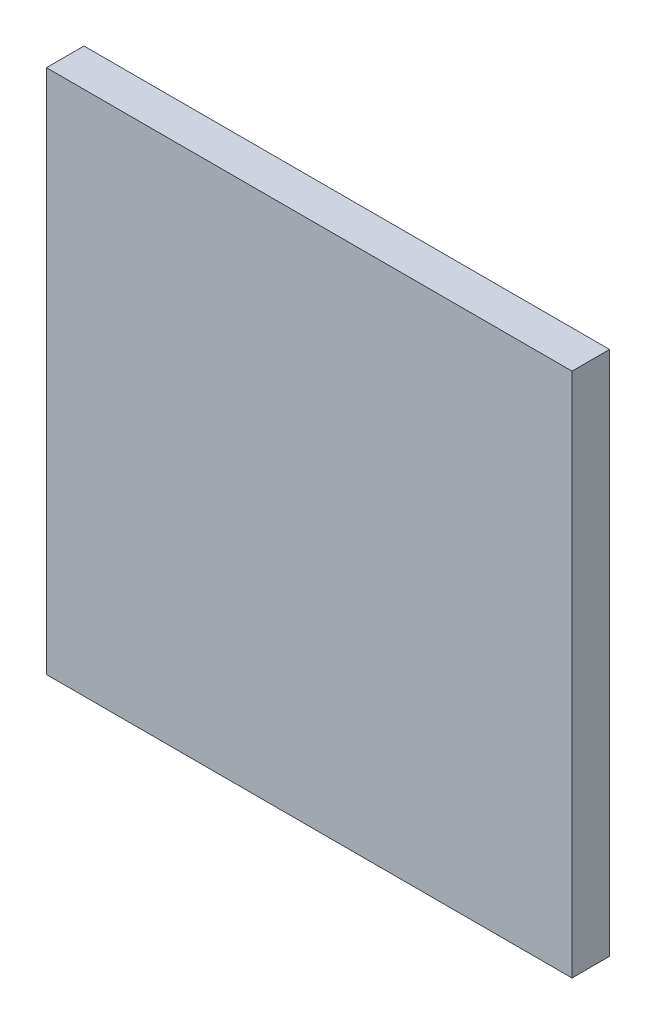
ISO-10303-21;
HEADER;
FILE_DESCRIPTION(('STEP AP214'),'2;1');
FILE_NAME('part.step','',(''),(''),'','','');
FILE_SCHEMA(('AUTOMOTIVE_DESIGN { 1 0 10303 214 1 1 1 1 }'));
ENDSEC;
DATA;
#1=APPLICATION_CONTEXT('core data for automotive mechanical design processes');
#2=APPLICATION_PROTOCOL_DEFINITION('international standard','automotive_design',2000,#1);
#3=PRODUCT_CONTEXT('',#1,'mechanical');
#4=PRODUCT('Part','Part','',(#3));
#5=PRODUCT_RELATED_PRODUCT_CATEGORY('part','',(#4));
#6=PRODUCT_DEFINITION_FORMATION('','',#4);
#7=PRODUCT_DEFINITION_CONTEXT('part definition',#1,'design');
#8=PRODUCT_DEFINITION('design','',#6,#7);
#9=PRODUCT_DEFINITION_SHAPE('','',#8);
#10=(LENGTH_UNIT() NAMED_UNIT(*) SI_UNIT(.MILLI.,.METRE.));
#11=(NAMED_UNIT(*) PLANE_ANGLE_UNIT() SI_UNIT($,.RADIAN.));
#12=(NAMED_UNIT(*) SI_UNIT($,.STERADIAN.) SOLID_ANGLE_UNIT());
#13=UNCERTAINTY_MEASURE_WITH_UNIT(LENGTH_MEASURE(1.E-05),#10,'distance_accuracy_value','');
#14=(GEOMETRIC_REPRESENTATION_CONTEXT(3) GLOBAL_UNCERTAINTY_ASSIGNED_CONTEXT((#13)) GLOBAL_UNIT_ASSIGNED_CONTEXT((#10,
#11,#12)) REPRESENTATION_CONTEXT('',''));
#15=CARTESIAN_POINT('',(0.,0.,0.));
#16=DIRECTION('',(0.,0.,1.));
#17=DIRECTION('',(1.,0.,0.));
#18=AXIS2_PLACEMENT_3D('',#15,#16,#17);
#19=CARTESIAN_POINT('',(1.75,-1.75,-0.25));
#20=DIRECTION('',(1.,0.,0.));
#21=DIRECTION('',(0.,0.,-1.));
#22=AXIS2_PLACEMENT_3D('',#19,#20,#21);
#23=PLANE('',#22);
#24=DIRECTION('',(0.,1.,0.));
#25=VECTOR('',#24,1.);
#26=CARTESIAN_POINT('',(1.75,-1.75,0.));
#27=LINE('',#26,#25);
#28=CARTESIAN_POINT('',(1.75,-1.75,0.));
#29=VERTEX_POINT('',#28);
#30=CARTESIAN_POINT('',(1.75,1.75,0.));
#31=VERTEX_POINT('',#30);
#32=EDGE_CURVE('E109',#29,#31,#27,.T.);
#33=ORIENTED_EDGE('',*,*,#32,.F.);
#34=DIRECTION('',(0.,0.,1.));
#35=VECTOR('',#34,1.);
#36=CARTESIAN_POINT('',(1.75,-1.75,-0.25));
#37=LINE('',#36,#35);
#38=CARTESIAN_POINT('',(1.75,-1.75,-0.25));
#39=VERTEX_POINT('',#38);
#40=EDGE_CURVE('E11',#39,#29,#37,.T.);
#41=ORIENTED_EDGE('',*,*,#40,.F.);
#42=DIRECTION('',(0.,1.,0.));
#43=VECTOR('',#42,1.);
#44=CARTESIAN_POINT('',(1.75,-1.75,-0.25));
#45=LINE('',#44,#43);
#46=CARTESIAN_POINT('',(1.75,1.75,-0.25));
#47=VERTEX_POINT('',#46);
#48=EDGE_CURVE('E101',#39,#47,#45,.T.);
#49=ORIENTED_EDGE('',*,*,#48,.T.);
#50=DIRECTION('',(0.,0.,1.));
#51=VECTOR('',#50,1.);
#52=CARTESIAN_POINT('',(1.75,1.75,-0.25));
#53=LINE('',#52,#51);
#54=EDGE_CURVE('E42',#47,#31,#53,.T.);
#55=ORIENTED_EDGE('',*,*,#54,.T.);
#56=EDGE_LOOP('',(#33,#41,#49,#55));
#57=FACE_BOUND('',#56,.T.);
#58=ADVANCED_FACE('F39',(#57),#23,.T.);
#59=CARTESIAN_POINT('',(-1.75,-1.75,-0.25));
#60=DIRECTION('',(0.,-1.,0.));
#61=DIRECTION('',(0.,0.,-1.));
#62=AXIS2_PLACEMENT_3D('',#59,#60,#61);
#63=PLANE('',#62);
#64=DIRECTION('',(1.,0.,0.));
#65=VECTOR('',#64,1.);
#66=CARTESIAN_POINT('',(-1.75,-1.75,0.));
#67=LINE('',#66,#65);
#68=CARTESIAN_POINT('',(-1.75,-1.75,0.));
#69=VERTEX_POINT('',#68);
#70=EDGE_CURVE('E104',#69,#29,#67,.T.);
#71=ORIENTED_EDGE('',*,*,#70,.F.);
#72=DIRECTION('',(0.,0.,1.));
#73=VECTOR('',#72,1.);
#74=CARTESIAN_POINT('',(-1.75,-1.75,-0.25));
#75=LINE('',#74,#73);
#76=CARTESIAN_POINT('',(-1.75,-1.75,-0.25));
#77=VERTEX_POINT('',#76);
#78=EDGE_CURVE('E49',#77,#69,#75,.T.);
#79=ORIENTED_EDGE('',*,*,#78,.F.);
#80=DIRECTION('',(1.,0.,0.));
#81=VECTOR('',#80,1.);
#82=CARTESIAN_POINT('',(-1.75,-1.75,-0.25));
#83=LINE('',#82,#81);
#84=EDGE_CURVE('E96',#77,#39,#83,.T.);
#85=ORIENTED_EDGE('',*,*,#84,.T.);
#86=ORIENTED_EDGE('',*,*,#40,.T.);
#87=EDGE_LOOP('',(#71,#79,#85,#86));
#88=FACE_BOUND('',#87,.T.);
#89=ADVANCED_FACE('F125',(#88),#63,.T.);
#90=CARTESIAN_POINT('',(-1.75,-1.75,-0.25));
#91=DIRECTION('',(-1.,0.,0.));
#92=DIRECTION('',(0.,0.,1.));
#93=AXIS2_PLACEMENT_3D('',#90,#91,#92);
#94=PLANE('',#93);
#95=DIRECTION('',(0.,-1.,0.));
#96=VECTOR('',#95,1.);
#97=CARTESIAN_POINT('',(-1.75,-1.75,0.));
#98=LINE('',#97,#96);
#99=CARTESIAN_POINT('',(-1.75,1.75,0.));
#100=VERTEX_POINT('',#99);
#101=EDGE_CURVE('E90',#100,#69,#98,.T.);
#102=ORIENTED_EDGE('',*,*,#101,.F.);
#103=DIRECTION('',(0.,0.,1.));
#104=VECTOR('',#103,1.);
#105=CARTESIAN_POINT('',(-1.75,1.75,-0.25));
#106=LINE('',#105,#104);
#107=CARTESIAN_POINT('',(-1.75,1.75,-0.25));
#108=VERTEX_POINT('',#107);
#109=EDGE_CURVE('E85',#108,#100,#106,.T.);
#110=ORIENTED_EDGE('',*,*,#109,.F.);
#111=DIRECTION('',(0.,-1.,0.));
#112=VECTOR('',#111,1.);
#113=CARTESIAN_POINT('',(-1.75,-1.75,-0.25));
#114=LINE('',#113,#112);
#115=EDGE_CURVE('E88',#108,#77,#114,.T.);
#116=ORIENTED_EDGE('',*,*,#115,.T.);
#117=ORIENTED_EDGE('',*,*,#78,.T.);
#118=EDGE_LOOP('',(#102,#110,#116,#117));
#119=FACE_BOUND('',#118,.T.);
#120=ADVANCED_FACE('F87',(#119),#94,.T.);
#121=CARTESIAN_POINT('',(-1.75,1.75,-0.25));
#122=DIRECTION('',(0.,1.,0.));
#123=DIRECTION('',(0.,0.,1.));
#124=AXIS2_PLACEMENT_3D('',#121,#122,#123);
#125=PLANE('',#124);
#126=DIRECTION('',(-1.,0.,0.));
#127=VECTOR('',#126,1.);
#128=CARTESIAN_POINT('',(-1.75,1.75,0.));
#129=LINE('',#128,#127);
#130=EDGE_CURVE('E113',#31,#100,#129,.T.);
#131=ORIENTED_EDGE('',*,*,#130,.F.);
#132=ORIENTED_EDGE('',*,*,#54,.F.);
#133=DIRECTION('',(-1.,0.,0.));
#134=VECTOR('',#133,1.);
#135=CARTESIAN_POINT('',(-1.75,1.75,-0.25));
#136=LINE('',#135,#134);
#137=EDGE_CURVE('E95',#47,#108,#136,.T.);
#138=ORIENTED_EDGE('',*,*,#137,.T.);
#139=ORIENTED_EDGE('',*,*,#109,.T.);
#140=EDGE_LOOP('',(#131,#132,#138,#139));
#141=FACE_BOUND('',#140,.T.);
#142=ADVANCED_FACE('F99',(#141),#125,.T.);
#143=CARTESIAN_POINT('',(0.,0.,-0.25));
#144=DIRECTION('',(0.,0.,-1.));
#145=DIRECTION('',(-1.,0.,0.));
#146=AXIS2_PLACEMENT_3D('',#143,#144,#145);
#147=PLANE('',#146);
#148=ORIENTED_EDGE('',*,*,#48,.F.);
#149=ORIENTED_EDGE('',*,*,#84,.F.);
#150=ORIENTED_EDGE('',*,*,#115,.F.);
#151=ORIENTED_EDGE('',*,*,#137,.F.);
#152=EDGE_LOOP('',(#148,#149,#150,#151));
#153=FACE_BOUND('',#152,.T.);
#154=ADVANCED_FACE('F94',(#153),#147,.T.);
#155=CARTESIAN_POINT('',(0.,0.,0.));
#156=DIRECTION('',(0.,0.,-1.));
#157=DIRECTION('',(-1.,0.,0.));
#158=AXIS2_PLACEMENT_3D('',#155,#156,#157);
#159=PLANE('',#158);
#160=ORIENTED_EDGE('',*,*,#32,.T.);
#161=ORIENTED_EDGE('',*,*,#130,.T.);
#162=ORIENTED_EDGE('',*,*,#101,.T.);
#163=ORIENTED_EDGE('',*,*,#70,.T.);
#164=EDGE_LOOP('',(#160,#161,#162,#163));
#165=FACE_BOUND('',#164,.T.);
#166=ADVANCED_FACE('F124',(#165),#159,.F.);
#167=CLOSED_SHELL('',(#58,#89,#120,#142,#154,#166));
#168=MANIFOLD_SOLID_BREP('B2',#167);
#169=ADVANCED_BREP_SHAPE_REPRESENTATION('',(#18,#168),#14);
#170=SHAPE_DEFINITION_REPRESENTATION(#9,#169);
ENDSEC;
END-ISO-10303-21;
